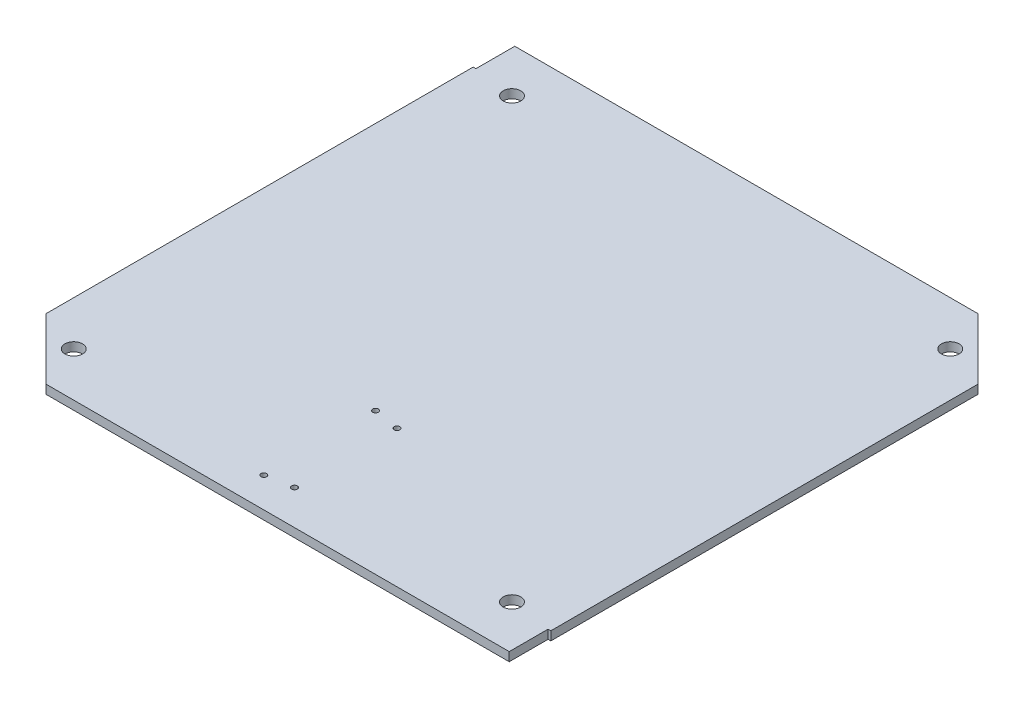
ISO-10303-21;
HEADER;
FILE_DESCRIPTION(('STEP AP214'),'2;1');
FILE_NAME('part.step','',(''),(''),'','','');
FILE_SCHEMA(('AUTOMOTIVE_DESIGN { 1 0 10303 214 1 1 1 1 }'));
ENDSEC;
DATA;
#1=APPLICATION_CONTEXT('core data for automotive mechanical design processes');
#2=APPLICATION_PROTOCOL_DEFINITION('international standard','automotive_design',2000,#1);
#3=PRODUCT_CONTEXT('',#1,'mechanical');
#4=PRODUCT('Part','Part','',(#3));
#5=PRODUCT_RELATED_PRODUCT_CATEGORY('part','',(#4));
#6=PRODUCT_DEFINITION_FORMATION('','',#4);
#7=PRODUCT_DEFINITION_CONTEXT('part definition',#1,'design');
#8=PRODUCT_DEFINITION('design','',#6,#7);
#9=PRODUCT_DEFINITION_SHAPE('','',#8);
#10=(LENGTH_UNIT() NAMED_UNIT(*) SI_UNIT(.MILLI.,.METRE.));
#11=(NAMED_UNIT(*) PLANE_ANGLE_UNIT() SI_UNIT($,.RADIAN.));
#12=(NAMED_UNIT(*) SI_UNIT($,.STERADIAN.) SOLID_ANGLE_UNIT());
#13=UNCERTAINTY_MEASURE_WITH_UNIT(LENGTH_MEASURE(1.E-05),#10,'distance_accuracy_value','');
#14=(GEOMETRIC_REPRESENTATION_CONTEXT(3) GLOBAL_UNCERTAINTY_ASSIGNED_CONTEXT((#13)) GLOBAL_UNIT_ASSIGNED_CONTEXT((#10,
#11,#12)) REPRESENTATION_CONTEXT('',''));
#15=CARTESIAN_POINT('',(0.,0.,0.));
#16=DIRECTION('',(0.,0.,1.));
#17=DIRECTION('',(1.,0.,0.));
#18=AXIS2_PLACEMENT_3D('',#15,#16,#17);
#19=CARTESIAN_POINT('',(-47.5,1.59,-40.5));
#20=DIRECTION('',(0.,0.,1.));
#21=DIRECTION('',(1.,0.,0.));
#22=AXIS2_PLACEMENT_3D('',#19,#20,#21);
#23=PLANE('',#22);
#24=DIRECTION('',(-1.,0.,0.));
#25=VECTOR('',#24,1.);
#26=CARTESIAN_POINT('',(-47.5,0.,-40.5));
#27=LINE('',#26,#25);
#28=CARTESIAN_POINT('',(-47.,0.,-40.5));
#29=VERTEX_POINT('',#28);
#30=CARTESIAN_POINT('',(-47.5,0.,-40.5));
#31=VERTEX_POINT('',#30);
#32=EDGE_CURVE('E153',#29,#31,#27,.T.);
#33=ORIENTED_EDGE('',*,*,#32,.T.);
#34=DIRECTION('',(0.,-1.,0.));
#35=VECTOR('',#34,1.);
#36=CARTESIAN_POINT('',(-47.5,1.59,-40.5));
#37=LINE('',#36,#35);
#38=CARTESIAN_POINT('',(-47.5,1.59,-40.5));
#39=VERTEX_POINT('',#38);
#40=EDGE_CURVE('E11',#39,#31,#37,.T.);
#41=ORIENTED_EDGE('',*,*,#40,.F.);
#42=DIRECTION('',(-1.,0.,0.));
#43=VECTOR('',#42,1.);
#44=CARTESIAN_POINT('',(-47.5,1.59,-40.5));
#45=LINE('',#44,#43);
#46=CARTESIAN_POINT('',(-47.,1.59,-40.5));
#47=VERTEX_POINT('',#46);
#48=EDGE_CURVE('E182',#47,#39,#45,.T.);
#49=ORIENTED_EDGE('',*,*,#48,.F.);
#50=DIRECTION('',(0.,-1.,0.));
#51=VECTOR('',#50,1.);
#52=CARTESIAN_POINT('',(-47.,1.59,-40.5));
#53=LINE('',#52,#51);
#54=EDGE_CURVE('E149',#47,#29,#53,.T.);
#55=ORIENTED_EDGE('',*,*,#54,.T.);
#56=EDGE_LOOP('',(#33,#41,#49,#55));
#57=FACE_BOUND('',#56,.T.);
#58=ADVANCED_FACE('F40',(#57),#23,.F.);
#59=CARTESIAN_POINT('',(-47.5,1.59,36.5));
#60=DIRECTION('',(1.,0.,0.));
#61=DIRECTION('',(0.,0.,-1.));
#62=AXIS2_PLACEMENT_3D('',#59,#60,#61);
#63=PLANE('',#62);
#64=DIRECTION('',(0.,0.,1.));
#65=VECTOR('',#64,1.);
#66=CARTESIAN_POINT('',(-47.5,0.,36.5));
#67=LINE('',#66,#65);
#68=CARTESIAN_POINT('',(-47.5,0.,36.5));
#69=VERTEX_POINT('',#68);
#70=EDGE_CURVE('E157',#31,#69,#67,.T.);
#71=ORIENTED_EDGE('',*,*,#70,.T.);
#72=DIRECTION('',(0.,-1.,0.));
#73=VECTOR('',#72,1.);
#74=CARTESIAN_POINT('',(-47.5,1.59,36.5));
#75=LINE('',#74,#73);
#76=CARTESIAN_POINT('',(-47.5,1.59,36.5));
#77=VERTEX_POINT('',#76);
#78=EDGE_CURVE('E49',#77,#69,#75,.T.);
#79=ORIENTED_EDGE('',*,*,#78,.F.);
#80=DIRECTION('',(0.,0.,1.));
#81=VECTOR('',#80,1.);
#82=CARTESIAN_POINT('',(-47.5,1.59,36.5));
#83=LINE('',#82,#81);
#84=EDGE_CURVE('E106',#39,#77,#83,.T.);
#85=ORIENTED_EDGE('',*,*,#84,.F.);
#86=ORIENTED_EDGE('',*,*,#40,.T.);
#87=EDGE_LOOP('',(#71,#79,#85,#86));
#88=FACE_BOUND('',#87,.T.);
#89=ADVANCED_FACE('F345',(#88),#63,.F.);
#90=CARTESIAN_POINT('',(-47.5,1.59,36.5));
#91=DIRECTION('',(0.707106781186548,0.,-0.707106781186547));
#92=DIRECTION('',(-0.707106781186547,0.,-0.707106781186548));
#93=AXIS2_PLACEMENT_3D('',#90,#91,#92);
#94=PLANE('',#93);
#95=DIRECTION('',(0.707106781186547,0.,0.707106781186548));
#96=VECTOR('',#95,1.);
#97=CARTESIAN_POINT('',(-47.5,0.,36.5));
#98=LINE('',#97,#96);
#99=CARTESIAN_POINT('',(-36.5,0.,47.5));
#100=VERTEX_POINT('',#99);
#101=EDGE_CURVE('E161',#69,#100,#98,.T.);
#102=ORIENTED_EDGE('',*,*,#101,.T.);
#103=DIRECTION('',(0.,-1.,0.));
#104=VECTOR('',#103,1.);
#105=CARTESIAN_POINT('',(-36.5,1.59,47.5));
#106=LINE('',#105,#104);
#107=CARTESIAN_POINT('',(-36.5,1.59,47.5));
#108=VERTEX_POINT('',#107);
#109=EDGE_CURVE('E201',#108,#100,#106,.T.);
#110=ORIENTED_EDGE('',*,*,#109,.F.);
#111=DIRECTION('',(0.707106781186547,0.,0.707106781186548));
#112=VECTOR('',#111,1.);
#113=CARTESIAN_POINT('',(-47.5,1.59,36.5));
#114=LINE('',#113,#112);
#115=EDGE_CURVE('E211',#77,#108,#114,.T.);
#116=ORIENTED_EDGE('',*,*,#115,.F.);
#117=ORIENTED_EDGE('',*,*,#78,.T.);
#118=EDGE_LOOP('',(#102,#110,#116,#117));
#119=FACE_BOUND('',#118,.T.);
#120=ADVANCED_FACE('F209',(#119),#94,.F.);
#121=CARTESIAN_POINT('',(-36.5,1.59,47.5));
#122=DIRECTION('',(0.,0.,-1.));
#123=DIRECTION('',(-1.,0.,0.));
#124=AXIS2_PLACEMENT_3D('',#121,#122,#123);
#125=PLANE('',#124);
#126=DIRECTION('',(1.,0.,0.));
#127=VECTOR('',#126,1.);
#128=CARTESIAN_POINT('',(-36.5,0.,47.5));
#129=LINE('',#128,#127);
#130=CARTESIAN_POINT('',(47.,0.,47.5));
#131=VERTEX_POINT('',#130);
#132=EDGE_CURVE('E164',#100,#131,#129,.T.);
#133=ORIENTED_EDGE('',*,*,#132,.T.);
#134=DIRECTION('',(0.,-1.,0.));
#135=VECTOR('',#134,1.);
#136=CARTESIAN_POINT('',(47.,1.59,47.5));
#137=LINE('',#136,#135);
#138=CARTESIAN_POINT('',(47.,1.59,47.5));
#139=VERTEX_POINT('',#138);
#140=EDGE_CURVE('E197',#139,#131,#137,.T.);
#141=ORIENTED_EDGE('',*,*,#140,.F.);
#142=DIRECTION('',(1.,0.,0.));
#143=VECTOR('',#142,1.);
#144=CARTESIAN_POINT('',(-36.5,1.59,47.5));
#145=LINE('',#144,#143);
#146=EDGE_CURVE('E230',#108,#139,#145,.T.);
#147=ORIENTED_EDGE('',*,*,#146,.F.);
#148=ORIENTED_EDGE('',*,*,#109,.T.);
#149=EDGE_LOOP('',(#133,#141,#147,#148));
#150=FACE_BOUND('',#149,.T.);
#151=ADVANCED_FACE('F220',(#150),#125,.F.);
#152=CARTESIAN_POINT('',(47.,1.59,47.5));
#153=DIRECTION('',(-1.,0.,0.));
#154=DIRECTION('',(0.,0.,1.));
#155=AXIS2_PLACEMENT_3D('',#152,#153,#154);
#156=PLANE('',#155);
#157=DIRECTION('',(0.,0.,-1.));
#158=VECTOR('',#157,1.);
#159=CARTESIAN_POINT('',(47.,0.,47.5));
#160=LINE('',#159,#158);
#161=CARTESIAN_POINT('',(47.,0.,40.5));
#162=VERTEX_POINT('',#161);
#163=EDGE_CURVE('E167',#131,#162,#160,.T.);
#164=ORIENTED_EDGE('',*,*,#163,.T.);
#165=DIRECTION('',(0.,-1.,0.));
#166=VECTOR('',#165,1.);
#167=CARTESIAN_POINT('',(47.,1.59,40.5));
#168=LINE('',#167,#166);
#169=CARTESIAN_POINT('',(47.,1.59,40.5));
#170=VERTEX_POINT('',#169);
#171=EDGE_CURVE('E193',#170,#162,#168,.T.);
#172=ORIENTED_EDGE('',*,*,#171,.F.);
#173=DIRECTION('',(0.,0.,-1.));
#174=VECTOR('',#173,1.);
#175=CARTESIAN_POINT('',(47.,1.59,47.5));
#176=LINE('',#175,#174);
#177=EDGE_CURVE('E226',#139,#170,#176,.T.);
#178=ORIENTED_EDGE('',*,*,#177,.F.);
#179=ORIENTED_EDGE('',*,*,#140,.T.);
#180=EDGE_LOOP('',(#164,#172,#178,#179));
#181=FACE_BOUND('',#180,.T.);
#182=ADVANCED_FACE('F224',(#181),#156,.F.);
#183=CARTESIAN_POINT('',(47.,1.59,40.5));
#184=DIRECTION('',(0.,0.,-1.));
#185=DIRECTION('',(-1.,0.,0.));
#186=AXIS2_PLACEMENT_3D('',#183,#184,#185);
#187=PLANE('',#186);
#188=DIRECTION('',(1.,0.,0.));
#189=VECTOR('',#188,1.);
#190=CARTESIAN_POINT('',(47.,0.,40.5));
#191=LINE('',#190,#189);
#192=CARTESIAN_POINT('',(47.5,0.,40.5));
#193=VERTEX_POINT('',#192);
#194=EDGE_CURVE('E170',#162,#193,#191,.T.);
#195=ORIENTED_EDGE('',*,*,#194,.T.);
#196=DIRECTION('',(0.,-1.,0.));
#197=VECTOR('',#196,1.);
#198=CARTESIAN_POINT('',(47.5,1.59,40.5));
#199=LINE('',#198,#197);
#200=CARTESIAN_POINT('',(47.5,1.59,40.5));
#201=VERTEX_POINT('',#200);
#202=EDGE_CURVE('E189',#201,#193,#199,.T.);
#203=ORIENTED_EDGE('',*,*,#202,.F.);
#204=DIRECTION('',(1.,0.,0.));
#205=VECTOR('',#204,1.);
#206=CARTESIAN_POINT('',(47.,1.59,40.5));
#207=LINE('',#206,#205);
#208=EDGE_CURVE('E229',#170,#201,#207,.T.);
#209=ORIENTED_EDGE('',*,*,#208,.F.);
#210=ORIENTED_EDGE('',*,*,#171,.T.);
#211=EDGE_LOOP('',(#195,#203,#209,#210));
#212=FACE_BOUND('',#211,.T.);
#213=ADVANCED_FACE('F357',(#212),#187,.F.);
#214=CARTESIAN_POINT('',(47.5,1.59,40.5));
#215=DIRECTION('',(-1.,0.,0.));
#216=DIRECTION('',(0.,0.,1.));
#217=AXIS2_PLACEMENT_3D('',#214,#215,#216);
#218=PLANE('',#217);
#219=DIRECTION('',(0.,0.,-1.));
#220=VECTOR('',#219,1.);
#221=CARTESIAN_POINT('',(47.5,0.,40.5));
#222=LINE('',#221,#220);
#223=CARTESIAN_POINT('',(47.5,0.,-36.5));
#224=VERTEX_POINT('',#223);
#225=EDGE_CURVE('E173',#193,#224,#222,.T.);
#226=ORIENTED_EDGE('',*,*,#225,.T.);
#227=DIRECTION('',(0.,-1.,0.));
#228=VECTOR('',#227,1.);
#229=CARTESIAN_POINT('',(47.5,1.59,-36.5));
#230=LINE('',#229,#228);
#231=CARTESIAN_POINT('',(47.5,1.59,-36.5));
#232=VERTEX_POINT('',#231);
#233=EDGE_CURVE('E142',#232,#224,#230,.T.);
#234=ORIENTED_EDGE('',*,*,#233,.F.);
#235=DIRECTION('',(0.,0.,-1.));
#236=VECTOR('',#235,1.);
#237=CARTESIAN_POINT('',(47.5,1.59,40.5));
#238=LINE('',#237,#236);
#239=EDGE_CURVE('E131',#201,#232,#238,.T.);
#240=ORIENTED_EDGE('',*,*,#239,.F.);
#241=ORIENTED_EDGE('',*,*,#202,.T.);
#242=EDGE_LOOP('',(#226,#234,#240,#241));
#243=FACE_BOUND('',#242,.T.);
#244=ADVANCED_FACE('F354',(#243),#218,.F.);
#245=CARTESIAN_POINT('',(36.5,1.59,-47.5));
#246=DIRECTION('',(-0.707106781186548,0.,0.707106781186547));
#247=DIRECTION('',(0.707106781186547,0.,0.707106781186548));
#248=AXIS2_PLACEMENT_3D('',#245,#246,#247);
#249=PLANE('',#248);
#250=DIRECTION('',(-0.707106781186547,0.,-0.707106781186548));
#251=VECTOR('',#250,1.);
#252=CARTESIAN_POINT('',(36.5,0.,-47.5));
#253=LINE('',#252,#251);
#254=CARTESIAN_POINT('',(36.5,0.,-47.5));
#255=VERTEX_POINT('',#254);
#256=EDGE_CURVE('E140',#224,#255,#253,.T.);
#257=ORIENTED_EDGE('',*,*,#256,.T.);
#258=DIRECTION('',(0.,-1.,0.));
#259=VECTOR('',#258,1.);
#260=CARTESIAN_POINT('',(36.5,1.59,-47.5));
#261=LINE('',#260,#259);
#262=CARTESIAN_POINT('',(36.5,1.59,-47.5));
#263=VERTEX_POINT('',#262);
#264=EDGE_CURVE('E137',#263,#255,#261,.T.);
#265=ORIENTED_EDGE('',*,*,#264,.F.);
#266=DIRECTION('',(-0.707106781186547,0.,-0.707106781186548));
#267=VECTOR('',#266,1.);
#268=CARTESIAN_POINT('',(36.5,1.59,-47.5));
#269=LINE('',#268,#267);
#270=EDGE_CURVE('E125',#232,#263,#269,.T.);
#271=ORIENTED_EDGE('',*,*,#270,.F.);
#272=ORIENTED_EDGE('',*,*,#233,.T.);
#273=EDGE_LOOP('',(#257,#265,#271,#272));
#274=FACE_BOUND('',#273,.T.);
#275=ADVANCED_FACE('F138',(#274),#249,.F.);
#276=CARTESIAN_POINT('',(-47.,1.59,-47.5));
#277=DIRECTION('',(0.,0.,1.));
#278=DIRECTION('',(1.,0.,0.));
#279=AXIS2_PLACEMENT_3D('',#276,#277,#278);
#280=PLANE('',#279);
#281=DIRECTION('',(-1.,0.,0.));
#282=VECTOR('',#281,1.);
#283=CARTESIAN_POINT('',(-47.,0.,-47.5));
#284=LINE('',#283,#282);
#285=CARTESIAN_POINT('',(-47.,0.,-47.5));
#286=VERTEX_POINT('',#285);
#287=EDGE_CURVE('E92',#255,#286,#284,.T.);
#288=ORIENTED_EDGE('',*,*,#287,.T.);
#289=DIRECTION('',(0.,-1.,0.));
#290=VECTOR('',#289,1.);
#291=CARTESIAN_POINT('',(-47.,1.59,-47.5));
#292=LINE('',#291,#290);
#293=CARTESIAN_POINT('',(-47.,1.59,-47.5));
#294=VERTEX_POINT('',#293);
#295=EDGE_CURVE('E143',#294,#286,#292,.T.);
#296=ORIENTED_EDGE('',*,*,#295,.F.);
#297=DIRECTION('',(-1.,0.,0.));
#298=VECTOR('',#297,1.);
#299=CARTESIAN_POINT('',(-47.,1.59,-47.5));
#300=LINE('',#299,#298);
#301=EDGE_CURVE('E129',#263,#294,#300,.T.);
#302=ORIENTED_EDGE('',*,*,#301,.F.);
#303=ORIENTED_EDGE('',*,*,#264,.T.);
#304=EDGE_LOOP('',(#288,#296,#302,#303));
#305=FACE_BOUND('',#304,.T.);
#306=ADVANCED_FACE('F145',(#305),#280,.F.);
#307=CARTESIAN_POINT('',(-47.,1.59,-40.5));
#308=DIRECTION('',(1.,0.,0.));
#309=DIRECTION('',(0.,0.,-1.));
#310=AXIS2_PLACEMENT_3D('',#307,#308,#309);
#311=PLANE('',#310);
#312=DIRECTION('',(0.,0.,1.));
#313=VECTOR('',#312,1.);
#314=CARTESIAN_POINT('',(-47.,0.,-40.5));
#315=LINE('',#314,#313);
#316=EDGE_CURVE('E98',#286,#29,#315,.T.);
#317=ORIENTED_EDGE('',*,*,#316,.T.);
#318=ORIENTED_EDGE('',*,*,#54,.F.);
#319=DIRECTION('',(0.,0.,1.));
#320=VECTOR('',#319,1.);
#321=CARTESIAN_POINT('',(-47.,1.59,-40.5));
#322=LINE('',#321,#320);
#323=EDGE_CURVE('E57',#294,#47,#322,.T.);
#324=ORIENTED_EDGE('',*,*,#323,.F.);
#325=ORIENTED_EDGE('',*,*,#295,.T.);
#326=EDGE_LOOP('',(#317,#318,#324,#325));
#327=FACE_BOUND('',#326,.T.);
#328=ADVANCED_FACE('F320',(#327),#311,.F.);
#329=CARTESIAN_POINT('',(0.,1.59,0.));
#330=DIRECTION('',(0.,1.,0.));
#331=DIRECTION('',(0.,0.,1.));
#332=AXIS2_PLACEMENT_3D('',#329,#330,#331);
#333=PLANE('',#332);
#334=CARTESIAN_POINT('',(-39.5,1.59,-39.5));
#335=DIRECTION('',(0.,1.,0.));
#336=DIRECTION('',(0.,0.,1.));
#337=AXIS2_PLACEMENT_3D('',#334,#335,#336);
#338=CIRCLE('',#337,1.59);
#339=CARTESIAN_POINT('',(-39.5,1.59,-37.91));
#340=VERTEX_POINT('',#339);
#341=EDGE_CURVE('E277',#340,#340,#338,.T.);
#342=ORIENTED_EDGE('',*,*,#341,.F.);
#343=EDGE_LOOP('',(#342));
#344=FACE_BOUND('',#343,.T.);
#345=CARTESIAN_POINT('',(39.5,1.59,-39.5));
#346=DIRECTION('',(0.,1.,0.));
#347=DIRECTION('',(0.,0.,1.));
#348=AXIS2_PLACEMENT_3D('',#345,#346,#347);
#349=CIRCLE('',#348,1.59);
#350=CARTESIAN_POINT('',(39.5,1.59,-37.91));
#351=VERTEX_POINT('',#350);
#352=EDGE_CURVE('E269',#351,#351,#349,.T.);
#353=ORIENTED_EDGE('',*,*,#352,.F.);
#354=EDGE_LOOP('',(#353));
#355=FACE_BOUND('',#354,.T.);
#356=CARTESIAN_POINT('',(39.5,1.59,39.5));
#357=DIRECTION('',(0.,1.,0.));
#358=DIRECTION('',(0.,0.,1.));
#359=AXIS2_PLACEMENT_3D('',#356,#357,#358);
#360=CIRCLE('',#359,1.59);
#361=CARTESIAN_POINT('',(39.5,1.59,41.09));
#362=VERTEX_POINT('',#361);
#363=EDGE_CURVE('E261',#362,#362,#360,.T.);
#364=ORIENTED_EDGE('',*,*,#363,.F.);
#365=EDGE_LOOP('',(#364));
#366=FACE_BOUND('',#365,.T.);
#367=CARTESIAN_POINT('',(-2.67000000000002,1.59,21.93));
#368=DIRECTION('',(0.,1.,0.));
#369=DIRECTION('',(0.,0.,1.));
#370=AXIS2_PLACEMENT_3D('',#367,#368,#369);
#371=CIRCLE('',#370,0.509999999999999);
#372=CARTESIAN_POINT('',(-2.67000000000002,1.59,22.44));
#373=VERTEX_POINT('',#372);
#374=EDGE_CURVE('E252',#373,#373,#371,.T.);
#375=ORIENTED_EDGE('',*,*,#374,.F.);
#376=EDGE_LOOP('',(#375));
#377=FACE_BOUND('',#376,.T.);
#378=CARTESIAN_POINT('',(2.02999999999999,1.59,41.24));
#379=DIRECTION('',(0.,1.,0.));
#380=DIRECTION('',(0.,0.,1.));
#381=AXIS2_PLACEMENT_3D('',#378,#379,#380);
#382=CIRCLE('',#381,0.510000000000002);
#383=CARTESIAN_POINT('',(2.02999999999999,1.59,41.75));
#384=VERTEX_POINT('',#383);
#385=EDGE_CURVE('E300',#384,#384,#382,.T.);
#386=ORIENTED_EDGE('',*,*,#385,.F.);
#387=EDGE_LOOP('',(#386));
#388=FACE_BOUND('',#387,.T.);
#389=CARTESIAN_POINT('',(-2.67000000000002,1.59,42.07));
#390=DIRECTION('',(0.,1.,0.));
#391=DIRECTION('',(0.,0.,1.));
#392=AXIS2_PLACEMENT_3D('',#389,#390,#391);
#393=CIRCLE('',#392,0.510000000000002);
#394=CARTESIAN_POINT('',(-2.67000000000002,1.59,42.58));
#395=VERTEX_POINT('',#394);
#396=EDGE_CURVE('E284',#395,#395,#393,.T.);
#397=ORIENTED_EDGE('',*,*,#396,.F.);
#398=EDGE_LOOP('',(#397));
#399=FACE_BOUND('',#398,.T.);
#400=CARTESIAN_POINT('',(2.02999999999999,1.59,22.75));
#401=DIRECTION('',(0.,1.,0.));
#402=DIRECTION('',(0.,0.,1.));
#403=AXIS2_PLACEMENT_3D('',#400,#401,#402);
#404=CIRCLE('',#403,0.509999999999999);
#405=CARTESIAN_POINT('',(2.02999999999999,1.59,23.26));
#406=VERTEX_POINT('',#405);
#407=EDGE_CURVE('E293',#406,#406,#404,.T.);
#408=ORIENTED_EDGE('',*,*,#407,.F.);
#409=EDGE_LOOP('',(#408));
#410=FACE_BOUND('',#409,.T.);
#411=CARTESIAN_POINT('',(-39.5,1.59,39.5));
#412=DIRECTION('',(0.,1.,0.));
#413=DIRECTION('',(0.,0.,1.));
#414=AXIS2_PLACEMENT_3D('',#411,#412,#413);
#415=CIRCLE('',#414,1.59);
#416=CARTESIAN_POINT('',(-39.5,1.59,41.09));
#417=VERTEX_POINT('',#416);
#418=EDGE_CURVE('E244',#417,#417,#415,.T.);
#419=ORIENTED_EDGE('',*,*,#418,.F.);
#420=EDGE_LOOP('',(#419));
#421=FACE_BOUND('',#420,.T.);
#422=ORIENTED_EDGE('',*,*,#48,.T.);
#423=ORIENTED_EDGE('',*,*,#84,.T.);
#424=ORIENTED_EDGE('',*,*,#115,.T.);
#425=ORIENTED_EDGE('',*,*,#146,.T.);
#426=ORIENTED_EDGE('',*,*,#177,.T.);
#427=ORIENTED_EDGE('',*,*,#208,.T.);
#428=ORIENTED_EDGE('',*,*,#239,.T.);
#429=ORIENTED_EDGE('',*,*,#270,.T.);
#430=ORIENTED_EDGE('',*,*,#301,.T.);
#431=ORIENTED_EDGE('',*,*,#323,.T.);
#432=EDGE_LOOP('',(#422,#423,#424,#425,#426,#427,#428,#429,#430,#431));
#433=FACE_BOUND('',#432,.T.);
#434=ADVANCED_FACE('F127',(#344,#355,#366,#377,#388,#399,#410,#421,#433),#333,.T.);
#435=CARTESIAN_POINT('',(0.,0.,0.));
#436=DIRECTION('',(0.,1.,0.));
#437=DIRECTION('',(0.,0.,1.));
#438=AXIS2_PLACEMENT_3D('',#435,#436,#437);
#439=PLANE('',#438);
#440=CARTESIAN_POINT('',(-39.5,0.,-39.5));
#441=DIRECTION('',(0.,1.,0.));
#442=DIRECTION('',(0.,0.,1.));
#443=AXIS2_PLACEMENT_3D('',#440,#441,#442);
#444=CIRCLE('',#443,1.59);
#445=CARTESIAN_POINT('',(-39.5,0.,-37.91));
#446=VERTEX_POINT('',#445);
#447=EDGE_CURVE('E248',#446,#446,#444,.T.);
#448=ORIENTED_EDGE('',*,*,#447,.T.);
#449=EDGE_LOOP('',(#448));
#450=FACE_BOUND('',#449,.T.);
#451=CARTESIAN_POINT('',(39.5,0.,-39.5));
#452=DIRECTION('',(0.,1.,0.));
#453=DIRECTION('',(0.,0.,1.));
#454=AXIS2_PLACEMENT_3D('',#451,#452,#453);
#455=CIRCLE('',#454,1.59);
#456=CARTESIAN_POINT('',(39.5,0.,-37.91));
#457=VERTEX_POINT('',#456);
#458=EDGE_CURVE('E273',#457,#457,#455,.T.);
#459=ORIENTED_EDGE('',*,*,#458,.T.);
#460=EDGE_LOOP('',(#459));
#461=FACE_BOUND('',#460,.T.);
#462=CARTESIAN_POINT('',(39.5,0.,39.5));
#463=DIRECTION('',(0.,1.,0.));
#464=DIRECTION('',(0.,0.,1.));
#465=AXIS2_PLACEMENT_3D('',#462,#463,#464);
#466=CIRCLE('',#465,1.59);
#467=CARTESIAN_POINT('',(39.5,0.,41.09));
#468=VERTEX_POINT('',#467);
#469=EDGE_CURVE('E265',#468,#468,#466,.T.);
#470=ORIENTED_EDGE('',*,*,#469,.T.);
#471=EDGE_LOOP('',(#470));
#472=FACE_BOUND('',#471,.T.);
#473=CARTESIAN_POINT('',(-2.67000000000002,0.,21.93));
#474=DIRECTION('',(0.,1.,0.));
#475=DIRECTION('',(0.,0.,1.));
#476=AXIS2_PLACEMENT_3D('',#473,#474,#475);
#477=CIRCLE('',#476,0.509999999999999);
#478=CARTESIAN_POINT('',(-2.67000000000002,0.,22.44));
#479=VERTEX_POINT('',#478);
#480=EDGE_CURVE('E256',#479,#479,#477,.T.);
#481=ORIENTED_EDGE('',*,*,#480,.T.);
#482=EDGE_LOOP('',(#481));
#483=FACE_BOUND('',#482,.T.);
#484=CARTESIAN_POINT('',(2.02999999999999,0.,41.24));
#485=DIRECTION('',(0.,1.,0.));
#486=DIRECTION('',(0.,0.,1.));
#487=AXIS2_PLACEMENT_3D('',#484,#485,#486);
#488=CIRCLE('',#487,0.510000000000002);
#489=CARTESIAN_POINT('',(2.02999999999999,0.,41.75));
#490=VERTEX_POINT('',#489);
#491=EDGE_CURVE('E289',#490,#490,#488,.T.);
#492=ORIENTED_EDGE('',*,*,#491,.T.);
#493=EDGE_LOOP('',(#492));
#494=FACE_BOUND('',#493,.T.);
#495=CARTESIAN_POINT('',(-2.67000000000002,0.,42.07));
#496=DIRECTION('',(0.,1.,0.));
#497=DIRECTION('',(0.,0.,1.));
#498=AXIS2_PLACEMENT_3D('',#495,#496,#497);
#499=CIRCLE('',#498,0.510000000000002);
#500=CARTESIAN_POINT('',(-2.67000000000002,0.,42.58));
#501=VERTEX_POINT('',#500);
#502=EDGE_CURVE('E288',#501,#501,#499,.T.);
#503=ORIENTED_EDGE('',*,*,#502,.T.);
#504=EDGE_LOOP('',(#503));
#505=FACE_BOUND('',#504,.T.);
#506=CARTESIAN_POINT('',(2.02999999999999,0.,22.75));
#507=DIRECTION('',(0.,1.,0.));
#508=DIRECTION('',(0.,0.,1.));
#509=AXIS2_PLACEMENT_3D('',#506,#507,#508);
#510=CIRCLE('',#509,0.509999999999999);
#511=CARTESIAN_POINT('',(2.02999999999999,0.,23.26));
#512=VERTEX_POINT('',#511);
#513=EDGE_CURVE('E257',#512,#512,#510,.T.);
#514=ORIENTED_EDGE('',*,*,#513,.T.);
#515=EDGE_LOOP('',(#514));
#516=FACE_BOUND('',#515,.T.);
#517=CARTESIAN_POINT('',(-39.5,0.,39.5));
#518=DIRECTION('',(0.,1.,0.));
#519=DIRECTION('',(0.,0.,1.));
#520=AXIS2_PLACEMENT_3D('',#517,#518,#519);
#521=CIRCLE('',#520,1.59);
#522=CARTESIAN_POINT('',(-39.5,0.,41.09));
#523=VERTEX_POINT('',#522);
#524=EDGE_CURVE('E158',#523,#523,#521,.T.);
#525=ORIENTED_EDGE('',*,*,#524,.T.);
#526=EDGE_LOOP('',(#525));
#527=FACE_BOUND('',#526,.T.);
#528=ORIENTED_EDGE('',*,*,#32,.F.);
#529=ORIENTED_EDGE('',*,*,#316,.F.);
#530=ORIENTED_EDGE('',*,*,#287,.F.);
#531=ORIENTED_EDGE('',*,*,#256,.F.);
#532=ORIENTED_EDGE('',*,*,#225,.F.);
#533=ORIENTED_EDGE('',*,*,#194,.F.);
#534=ORIENTED_EDGE('',*,*,#163,.F.);
#535=ORIENTED_EDGE('',*,*,#132,.F.);
#536=ORIENTED_EDGE('',*,*,#101,.F.);
#537=ORIENTED_EDGE('',*,*,#70,.F.);
#538=EDGE_LOOP('',(#528,#529,#530,#531,#532,#533,#534,#535,#536,#537));
#539=FACE_BOUND('',#538,.T.);
#540=ADVANCED_FACE('F215',(#450,#461,#472,#483,#494,#505,#516,#527,#539),#439,.F.);
#541=CARTESIAN_POINT('',(-39.5,0.,39.5));
#542=DIRECTION('',(0.,1.,0.));
#543=DIRECTION('',(0.,0.,1.));
#544=AXIS2_PLACEMENT_3D('',#541,#542,#543);
#545=CYLINDRICAL_SURFACE('',#544,1.59);
#546=CARTESIAN_POINT('',(-39.5,0.,41.09));
#547=CARTESIAN_POINT('',(-39.5,0.0165625,41.09));
#548=CARTESIAN_POINT('',(-39.5,0.033125,41.09));
#549=CARTESIAN_POINT('',(-39.5,0.06625,41.09));
#550=CARTESIAN_POINT('',(-39.5,0.0828125,41.09));
#551=CARTESIAN_POINT('',(-39.5,0.1159375,41.09));
#552=CARTESIAN_POINT('',(-39.5,0.1325,41.09));
#553=CARTESIAN_POINT('',(-39.5,0.165625,41.09));
#554=CARTESIAN_POINT('',(-39.5,0.1821875,41.09));
#555=CARTESIAN_POINT('',(-39.5,0.2153125,41.09));
#556=CARTESIAN_POINT('',(-39.5,0.231875,41.09));
#557=CARTESIAN_POINT('',(-39.5,0.265,41.09));
#558=CARTESIAN_POINT('',(-39.5,0.2815625,41.09));
#559=CARTESIAN_POINT('',(-39.5,0.3146875,41.09));
#560=CARTESIAN_POINT('',(-39.5,0.33125,41.09));
#561=CARTESIAN_POINT('',(-39.5,0.364375,41.09));
#562=CARTESIAN_POINT('',(-39.5,0.3809375,41.09));
#563=CARTESIAN_POINT('',(-39.5,0.4140625,41.09));
#564=CARTESIAN_POINT('',(-39.5,0.430625,41.09));
#565=CARTESIAN_POINT('',(-39.5,0.46375,41.09));
#566=CARTESIAN_POINT('',(-39.5,0.4803125,41.09));
#567=CARTESIAN_POINT('',(-39.5,0.5134375,41.09));
#568=CARTESIAN_POINT('',(-39.5,0.53,41.09));
#569=CARTESIAN_POINT('',(-39.5,0.563125,41.09));
#570=CARTESIAN_POINT('',(-39.5,0.5796875,41.09));
#571=CARTESIAN_POINT('',(-39.5,0.6128125,41.09));
#572=CARTESIAN_POINT('',(-39.5,0.629375,41.09));
#573=CARTESIAN_POINT('',(-39.5,0.6625,41.09));
#574=CARTESIAN_POINT('',(-39.5,0.6790625,41.09));
#575=CARTESIAN_POINT('',(-39.5,0.7121875,41.09));
#576=CARTESIAN_POINT('',(-39.5,0.72875,41.09));
#577=CARTESIAN_POINT('',(-39.5,0.761875,41.09));
#578=CARTESIAN_POINT('',(-39.5,0.7784375,41.09));
#579=CARTESIAN_POINT('',(-39.5,0.8115625,41.09));
#580=CARTESIAN_POINT('',(-39.5,0.828125,41.09));
#581=CARTESIAN_POINT('',(-39.5,0.86125,41.09));
#582=CARTESIAN_POINT('',(-39.5,0.8778125,41.09));
#583=CARTESIAN_POINT('',(-39.5,0.9109375,41.09));
#584=CARTESIAN_POINT('',(-39.5,0.9275,41.09));
#585=CARTESIAN_POINT('',(-39.5,0.960625,41.09));
#586=CARTESIAN_POINT('',(-39.5,0.9771875,41.09));
#587=CARTESIAN_POINT('',(-39.5,1.0103125,41.09));
#588=CARTESIAN_POINT('',(-39.5,1.026875,41.09));
#589=CARTESIAN_POINT('',(-39.5,1.06,41.09));
#590=CARTESIAN_POINT('',(-39.5,1.0765625,41.09));
#591=CARTESIAN_POINT('',(-39.5,1.1096875,41.09));
#592=CARTESIAN_POINT('',(-39.5,1.12625,41.09));
#593=CARTESIAN_POINT('',(-39.5,1.159375,41.09));
#594=CARTESIAN_POINT('',(-39.5,1.1759375,41.09));
#595=CARTESIAN_POINT('',(-39.5,1.2090625,41.09));
#596=CARTESIAN_POINT('',(-39.5,1.225625,41.09));
#597=CARTESIAN_POINT('',(-39.5,1.25875,41.09));
#598=CARTESIAN_POINT('',(-39.5,1.2753125,41.09));
#599=CARTESIAN_POINT('',(-39.5,1.3084375,41.09));
#600=CARTESIAN_POINT('',(-39.5,1.325,41.09));
#601=CARTESIAN_POINT('',(-39.5,1.358125,41.09));
#602=CARTESIAN_POINT('',(-39.5,1.3746875,41.09));
#603=CARTESIAN_POINT('',(-39.5,1.4078125,41.09));
#604=CARTESIAN_POINT('',(-39.5,1.424375,41.09));
#605=CARTESIAN_POINT('',(-39.5,1.4575,41.09));
#606=CARTESIAN_POINT('',(-39.5,1.4740625,41.09));
#607=CARTESIAN_POINT('',(-39.5,1.5071875,41.09));
#608=CARTESIAN_POINT('',(-39.5,1.52375,41.09));
#609=CARTESIAN_POINT('',(-39.5,1.556875,41.09));
#610=CARTESIAN_POINT('',(-39.5,1.5734375,41.09));
#611=CARTESIAN_POINT('',(-39.5,1.59,41.09));
#612=B_SPLINE_CURVE_WITH_KNOTS('',3,(#546,#547,#548,#549,#550,#551,#552,#553,#554,#555,#556,
#557,#558,#559,#560,#561,#562,#563,#564,#565,#566,#567,#568,#569,#570,#571,#572,#573,#574,#575,
#576,#577,#578,#579,#580,#581,#582,#583,#584,#585,#586,#587,#588,#589,#590,#591,#592,#593,#594,
#595,#596,#597,#598,#599,#600,#601,#602,#603,#604,#605,#606,#607,#608,#609,#610,#611),
.UNSPECIFIED.,.F.,.F.,(4,2,2,2,2,2,2,2,2,2,2,2,2,2,2,2,2,2,2,2,2,2,2,2,2,2,2,2,2,2,2,2,4),(0.,
0.0496875,0.099375,0.1490625,0.19875,0.2484375,0.298125,0.3478125,0.3975,0.4471875,0.496875,
0.5465625,0.59625,0.6459375,0.695625,0.7453125,0.795,0.8446875,0.894375,0.9440625,0.99375,
1.0434375,1.093125,1.1428125,1.1925,1.2421875,1.291875,1.3415625,1.39125,1.4409375,1.490625,
1.5403125,1.59),.UNSPECIFIED.);
#613=EDGE_CURVE('BSEAM329',#523,#417,#612,.T.);
#614=ORIENTED_EDGE('',*,*,#524,.F.);
#615=ORIENTED_EDGE('',*,*,#418,.T.);
#616=ORIENTED_EDGE('',*,*,#613,.T.);
#617=ORIENTED_EDGE('',*,*,#613,.F.);
#618=EDGE_LOOP('',(#614,#616,#615,#617));
#619=FACE_BOUND('',#618,.T.);
#620=ADVANCED_FACE('F329',(#619),#545,.F.);
#621=CARTESIAN_POINT('',(2.02999999999999,0.,22.75));
#622=DIRECTION('',(0.,1.,0.));
#623=DIRECTION('',(0.,0.,1.));
#624=AXIS2_PLACEMENT_3D('',#621,#622,#623);
#625=CYLINDRICAL_SURFACE('',#624,0.509999999999999);
#626=ORIENTED_EDGE('',*,*,#513,.F.);
#627=EDGE_LOOP('',(#626));
#628=FACE_BOUND('',#627,.T.);
#629=ORIENTED_EDGE('',*,*,#407,.T.);
#630=EDGE_LOOP('',(#629));
#631=FACE_BOUND('',#630,.T.);
#632=ADVANCED_FACE('F331',(#628,#631),#625,.F.);
#633=CARTESIAN_POINT('',(-2.67000000000002,0.,42.07));
#634=DIRECTION('',(0.,1.,0.));
#635=DIRECTION('',(0.,0.,1.));
#636=AXIS2_PLACEMENT_3D('',#633,#634,#635);
#637=CYLINDRICAL_SURFACE('',#636,0.510000000000002);
#638=ORIENTED_EDGE('',*,*,#502,.F.);
#639=EDGE_LOOP('',(#638));
#640=FACE_BOUND('',#639,.T.);
#641=ORIENTED_EDGE('',*,*,#396,.T.);
#642=EDGE_LOOP('',(#641));
#643=FACE_BOUND('',#642,.T.);
#644=ADVANCED_FACE('F314',(#640,#643),#637,.F.);
#645=CARTESIAN_POINT('',(2.02999999999999,0.,41.24));
#646=DIRECTION('',(0.,1.,0.));
#647=DIRECTION('',(0.,0.,1.));
#648=AXIS2_PLACEMENT_3D('',#645,#646,#647);
#649=CYLINDRICAL_SURFACE('',#648,0.510000000000002);
#650=ORIENTED_EDGE('',*,*,#491,.F.);
#651=EDGE_LOOP('',(#650));
#652=FACE_BOUND('',#651,.T.);
#653=ORIENTED_EDGE('',*,*,#385,.T.);
#654=EDGE_LOOP('',(#653));
#655=FACE_BOUND('',#654,.T.);
#656=ADVANCED_FACE('F310',(#652,#655),#649,.F.);
#657=CARTESIAN_POINT('',(-2.67000000000002,0.,21.93));
#658=DIRECTION('',(0.,1.,0.));
#659=DIRECTION('',(0.,0.,1.));
#660=AXIS2_PLACEMENT_3D('',#657,#658,#659);
#661=CYLINDRICAL_SURFACE('',#660,0.509999999999999);
#662=ORIENTED_EDGE('',*,*,#480,.F.);
#663=EDGE_LOOP('',(#662));
#664=FACE_BOUND('',#663,.T.);
#665=ORIENTED_EDGE('',*,*,#374,.T.);
#666=EDGE_LOOP('',(#665));
#667=FACE_BOUND('',#666,.T.);
#668=ADVANCED_FACE('F313',(#664,#667),#661,.F.);
#669=CARTESIAN_POINT('',(39.5,0.,39.5));
#670=DIRECTION('',(0.,1.,0.));
#671=DIRECTION('',(0.,0.,1.));
#672=AXIS2_PLACEMENT_3D('',#669,#670,#671);
#673=CYLINDRICAL_SURFACE('',#672,1.59);
#674=CARTESIAN_POINT('',(39.5,0.,41.09));
#675=CARTESIAN_POINT('',(39.5,0.0165625,41.09));
#676=CARTESIAN_POINT('',(39.5,0.033125,41.09));
#677=CARTESIAN_POINT('',(39.5,0.06625,41.09));
#678=CARTESIAN_POINT('',(39.5,0.0828125,41.09));
#679=CARTESIAN_POINT('',(39.5,0.1159375,41.09));
#680=CARTESIAN_POINT('',(39.5,0.1325,41.09));
#681=CARTESIAN_POINT('',(39.5,0.165625,41.09));
#682=CARTESIAN_POINT('',(39.5,0.1821875,41.09));
#683=CARTESIAN_POINT('',(39.5,0.2153125,41.09));
#684=CARTESIAN_POINT('',(39.5,0.231875,41.09));
#685=CARTESIAN_POINT('',(39.5,0.265,41.09));
#686=CARTESIAN_POINT('',(39.5,0.2815625,41.09));
#687=CARTESIAN_POINT('',(39.5,0.3146875,41.09));
#688=CARTESIAN_POINT('',(39.5,0.33125,41.09));
#689=CARTESIAN_POINT('',(39.5,0.364375,41.09));
#690=CARTESIAN_POINT('',(39.5,0.3809375,41.09));
#691=CARTESIAN_POINT('',(39.5,0.4140625,41.09));
#692=CARTESIAN_POINT('',(39.5,0.430625,41.09));
#693=CARTESIAN_POINT('',(39.5,0.46375,41.09));
#694=CARTESIAN_POINT('',(39.5,0.4803125,41.09));
#695=CARTESIAN_POINT('',(39.5,0.5134375,41.09));
#696=CARTESIAN_POINT('',(39.5,0.53,41.09));
#697=CARTESIAN_POINT('',(39.5,0.563125,41.09));
#698=CARTESIAN_POINT('',(39.5,0.5796875,41.09));
#699=CARTESIAN_POINT('',(39.5,0.6128125,41.09));
#700=CARTESIAN_POINT('',(39.5,0.629375,41.09));
#701=CARTESIAN_POINT('',(39.5,0.6625,41.09));
#702=CARTESIAN_POINT('',(39.5,0.6790625,41.09));
#703=CARTESIAN_POINT('',(39.5,0.7121875,41.09));
#704=CARTESIAN_POINT('',(39.5,0.72875,41.09));
#705=CARTESIAN_POINT('',(39.5,0.761875,41.09));
#706=CARTESIAN_POINT('',(39.5,0.7784375,41.09));
#707=CARTESIAN_POINT('',(39.5,0.8115625,41.09));
#708=CARTESIAN_POINT('',(39.5,0.828125,41.09));
#709=CARTESIAN_POINT('',(39.5,0.86125,41.09));
#710=CARTESIAN_POINT('',(39.5,0.8778125,41.09));
#711=CARTESIAN_POINT('',(39.5,0.9109375,41.09));
#712=CARTESIAN_POINT('',(39.5,0.9275,41.09));
#713=CARTESIAN_POINT('',(39.5,0.960625,41.09));
#714=CARTESIAN_POINT('',(39.5,0.9771875,41.09));
#715=CARTESIAN_POINT('',(39.5,1.0103125,41.09));
#716=CARTESIAN_POINT('',(39.5,1.026875,41.09));
#717=CARTESIAN_POINT('',(39.5,1.06,41.09));
#718=CARTESIAN_POINT('',(39.5,1.0765625,41.09));
#719=CARTESIAN_POINT('',(39.5,1.1096875,41.09));
#720=CARTESIAN_POINT('',(39.5,1.12625,41.09));
#721=CARTESIAN_POINT('',(39.5,1.159375,41.09));
#722=CARTESIAN_POINT('',(39.5,1.1759375,41.09));
#723=CARTESIAN_POINT('',(39.5,1.2090625,41.09));
#724=CARTESIAN_POINT('',(39.5,1.225625,41.09));
#725=CARTESIAN_POINT('',(39.5,1.25875,41.09));
#726=CARTESIAN_POINT('',(39.5,1.2753125,41.09));
#727=CARTESIAN_POINT('',(39.5,1.3084375,41.09));
#728=CARTESIAN_POINT('',(39.5,1.325,41.09));
#729=CARTESIAN_POINT('',(39.5,1.358125,41.09));
#730=CARTESIAN_POINT('',(39.5,1.3746875,41.09));
#731=CARTESIAN_POINT('',(39.5,1.4078125,41.09));
#732=CARTESIAN_POINT('',(39.5,1.424375,41.09));
#733=CARTESIAN_POINT('',(39.5,1.4575,41.09));
#734=CARTESIAN_POINT('',(39.5,1.4740625,41.09));
#735=CARTESIAN_POINT('',(39.5,1.5071875,41.09));
#736=CARTESIAN_POINT('',(39.5,1.52375,41.09));
#737=CARTESIAN_POINT('',(39.5,1.556875,41.09));
#738=CARTESIAN_POINT('',(39.5,1.5734375,41.09));
#739=CARTESIAN_POINT('',(39.5,1.59,41.09));
#740=B_SPLINE_CURVE_WITH_KNOTS('',3,(#674,#675,#676,#677,#678,#679,#680,#681,#682,#683,#684,
#685,#686,#687,#688,#689,#690,#691,#692,#693,#694,#695,#696,#697,#698,#699,#700,#701,#702,#703,
#704,#705,#706,#707,#708,#709,#710,#711,#712,#713,#714,#715,#716,#717,#718,#719,#720,#721,#722,
#723,#724,#725,#726,#727,#728,#729,#730,#731,#732,#733,#734,#735,#736,#737,#738,#739),
.UNSPECIFIED.,.F.,.F.,(4,2,2,2,2,2,2,2,2,2,2,2,2,2,2,2,2,2,2,2,2,2,2,2,2,2,2,2,2,2,2,2,4),(0.,
0.0496875,0.099375,0.1490625,0.19875,0.2484375,0.298125,0.3478125,0.3975,0.4471875,0.496875,
0.5465625,0.59625,0.6459375,0.695625,0.7453125,0.795,0.8446875,0.894375,0.9440625,0.99375,
1.0434375,1.093125,1.1428125,1.1925,1.2421875,1.291875,1.3415625,1.39125,1.4409375,1.490625,
1.5403125,1.59),.UNSPECIFIED.);
#741=EDGE_CURVE('BSEAM462',#468,#362,#740,.T.);
#742=ORIENTED_EDGE('',*,*,#469,.F.);
#743=ORIENTED_EDGE('',*,*,#363,.T.);
#744=ORIENTED_EDGE('',*,*,#741,.T.);
#745=ORIENTED_EDGE('',*,*,#741,.F.);
#746=EDGE_LOOP('',(#742,#744,#743,#745));
#747=FACE_BOUND('',#746,.T.);
#748=ADVANCED_FACE('F462',(#747),#673,.F.);
#749=CARTESIAN_POINT('',(39.5,0.,-39.5));
#750=DIRECTION('',(0.,1.,0.));
#751=DIRECTION('',(0.,0.,1.));
#752=AXIS2_PLACEMENT_3D('',#749,#750,#751);
#753=CYLINDRICAL_SURFACE('',#752,1.59);
#754=CARTESIAN_POINT('',(39.5,0.,-37.91));
#755=CARTESIAN_POINT('',(39.5,0.0165625,-37.91));
#756=CARTESIAN_POINT('',(39.5,0.033125,-37.91));
#757=CARTESIAN_POINT('',(39.5,0.06625,-37.91));
#758=CARTESIAN_POINT('',(39.5,0.0828125,-37.91));
#759=CARTESIAN_POINT('',(39.5,0.1159375,-37.91));
#760=CARTESIAN_POINT('',(39.5,0.1325,-37.91));
#761=CARTESIAN_POINT('',(39.5,0.165625,-37.91));
#762=CARTESIAN_POINT('',(39.5,0.1821875,-37.91));
#763=CARTESIAN_POINT('',(39.5,0.2153125,-37.91));
#764=CARTESIAN_POINT('',(39.5,0.231875,-37.91));
#765=CARTESIAN_POINT('',(39.5,0.265,-37.91));
#766=CARTESIAN_POINT('',(39.5,0.2815625,-37.91));
#767=CARTESIAN_POINT('',(39.5,0.3146875,-37.91));
#768=CARTESIAN_POINT('',(39.5,0.33125,-37.91));
#769=CARTESIAN_POINT('',(39.5,0.364375,-37.91));
#770=CARTESIAN_POINT('',(39.5,0.3809375,-37.91));
#771=CARTESIAN_POINT('',(39.5,0.4140625,-37.91));
#772=CARTESIAN_POINT('',(39.5,0.430625,-37.91));
#773=CARTESIAN_POINT('',(39.5,0.46375,-37.91));
#774=CARTESIAN_POINT('',(39.5,0.4803125,-37.91));
#775=CARTESIAN_POINT('',(39.5,0.5134375,-37.91));
#776=CARTESIAN_POINT('',(39.5,0.53,-37.91));
#777=CARTESIAN_POINT('',(39.5,0.563125,-37.91));
#778=CARTESIAN_POINT('',(39.5,0.5796875,-37.91));
#779=CARTESIAN_POINT('',(39.5,0.6128125,-37.91));
#780=CARTESIAN_POINT('',(39.5,0.629375,-37.91));
#781=CARTESIAN_POINT('',(39.5,0.6625,-37.91));
#782=CARTESIAN_POINT('',(39.5,0.6790625,-37.91));
#783=CARTESIAN_POINT('',(39.5,0.7121875,-37.91));
#784=CARTESIAN_POINT('',(39.5,0.72875,-37.91));
#785=CARTESIAN_POINT('',(39.5,0.761875,-37.91));
#786=CARTESIAN_POINT('',(39.5,0.7784375,-37.91));
#787=CARTESIAN_POINT('',(39.5,0.8115625,-37.91));
#788=CARTESIAN_POINT('',(39.5,0.828125,-37.91));
#789=CARTESIAN_POINT('',(39.5,0.86125,-37.91));
#790=CARTESIAN_POINT('',(39.5,0.8778125,-37.91));
#791=CARTESIAN_POINT('',(39.5,0.9109375,-37.91));
#792=CARTESIAN_POINT('',(39.5,0.9275,-37.91));
#793=CARTESIAN_POINT('',(39.5,0.960625,-37.91));
#794=CARTESIAN_POINT('',(39.5,0.9771875,-37.91));
#795=CARTESIAN_POINT('',(39.5,1.0103125,-37.91));
#796=CARTESIAN_POINT('',(39.5,1.026875,-37.91));
#797=CARTESIAN_POINT('',(39.5,1.06,-37.91));
#798=CARTESIAN_POINT('',(39.5,1.0765625,-37.91));
#799=CARTESIAN_POINT('',(39.5,1.1096875,-37.91));
#800=CARTESIAN_POINT('',(39.5,1.12625,-37.91));
#801=CARTESIAN_POINT('',(39.5,1.159375,-37.91));
#802=CARTESIAN_POINT('',(39.5,1.1759375,-37.91));
#803=CARTESIAN_POINT('',(39.5,1.2090625,-37.91));
#804=CARTESIAN_POINT('',(39.5,1.225625,-37.91));
#805=CARTESIAN_POINT('',(39.5,1.25875,-37.91));
#806=CARTESIAN_POINT('',(39.5,1.2753125,-37.91));
#807=CARTESIAN_POINT('',(39.5,1.3084375,-37.91));
#808=CARTESIAN_POINT('',(39.5,1.325,-37.91));
#809=CARTESIAN_POINT('',(39.5,1.358125,-37.91));
#810=CARTESIAN_POINT('',(39.5,1.3746875,-37.91));
#811=CARTESIAN_POINT('',(39.5,1.4078125,-37.91));
#812=CARTESIAN_POINT('',(39.5,1.424375,-37.91));
#813=CARTESIAN_POINT('',(39.5,1.4575,-37.91));
#814=CARTESIAN_POINT('',(39.5,1.4740625,-37.91));
#815=CARTESIAN_POINT('',(39.5,1.5071875,-37.91));
#816=CARTESIAN_POINT('',(39.5,1.52375,-37.91));
#817=CARTESIAN_POINT('',(39.5,1.556875,-37.91));
#818=CARTESIAN_POINT('',(39.5,1.5734375,-37.91));
#819=CARTESIAN_POINT('',(39.5,1.59,-37.91));
#820=B_SPLINE_CURVE_WITH_KNOTS('',3,(#754,#755,#756,#757,#758,#759,#760,#761,#762,#763,#764,
#765,#766,#767,#768,#769,#770,#771,#772,#773,#774,#775,#776,#777,#778,#779,#780,#781,#782,#783,
#784,#785,#786,#787,#788,#789,#790,#791,#792,#793,#794,#795,#796,#797,#798,#799,#800,#801,#802,
#803,#804,#805,#806,#807,#808,#809,#810,#811,#812,#813,#814,#815,#816,#817,#818,#819),
.UNSPECIFIED.,.F.,.F.,(4,2,2,2,2,2,2,2,2,2,2,2,2,2,2,2,2,2,2,2,2,2,2,2,2,2,2,2,2,2,2,2,4),(0.,
0.0496875,0.099375,0.1490625,0.19875,0.2484375,0.298125,0.3478125,0.3975,0.4471875,0.496875,
0.5465625,0.59625,0.6459375,0.695625,0.7453125,0.795,0.8446875,0.894375,0.9440625,0.99375,
1.0434375,1.093125,1.1428125,1.1925,1.2421875,1.291875,1.3415625,1.39125,1.4409375,1.490625,
1.5403125,1.59),.UNSPECIFIED.);
#821=EDGE_CURVE('BSEAM471',#457,#351,#820,.T.);
#822=ORIENTED_EDGE('',*,*,#458,.F.);
#823=ORIENTED_EDGE('',*,*,#352,.T.);
#824=ORIENTED_EDGE('',*,*,#821,.T.);
#825=ORIENTED_EDGE('',*,*,#821,.F.);
#826=EDGE_LOOP('',(#822,#824,#823,#825));
#827=FACE_BOUND('',#826,.T.);
#828=ADVANCED_FACE('F471',(#827),#753,.F.);
#829=CARTESIAN_POINT('',(-39.5,0.,-39.5));
#830=DIRECTION('',(0.,1.,0.));
#831=DIRECTION('',(0.,0.,1.));
#832=AXIS2_PLACEMENT_3D('',#829,#830,#831);
#833=CYLINDRICAL_SURFACE('',#832,1.59);
#834=CARTESIAN_POINT('',(-39.5,0.,-37.91));
#835=CARTESIAN_POINT('',(-39.5,0.0165625,-37.91));
#836=CARTESIAN_POINT('',(-39.5,0.033125,-37.91));
#837=CARTESIAN_POINT('',(-39.5,0.06625,-37.91));
#838=CARTESIAN_POINT('',(-39.5,0.0828125,-37.91));
#839=CARTESIAN_POINT('',(-39.5,0.1159375,-37.91));
#840=CARTESIAN_POINT('',(-39.5,0.1325,-37.91));
#841=CARTESIAN_POINT('',(-39.5,0.165625,-37.91));
#842=CARTESIAN_POINT('',(-39.5,0.1821875,-37.91));
#843=CARTESIAN_POINT('',(-39.5,0.2153125,-37.91));
#844=CARTESIAN_POINT('',(-39.5,0.231875,-37.91));
#845=CARTESIAN_POINT('',(-39.5,0.265,-37.91));
#846=CARTESIAN_POINT('',(-39.5,0.2815625,-37.91));
#847=CARTESIAN_POINT('',(-39.5,0.3146875,-37.91));
#848=CARTESIAN_POINT('',(-39.5,0.33125,-37.91));
#849=CARTESIAN_POINT('',(-39.5,0.364375,-37.91));
#850=CARTESIAN_POINT('',(-39.5,0.3809375,-37.91));
#851=CARTESIAN_POINT('',(-39.5,0.4140625,-37.91));
#852=CARTESIAN_POINT('',(-39.5,0.430625,-37.91));
#853=CARTESIAN_POINT('',(-39.5,0.46375,-37.91));
#854=CARTESIAN_POINT('',(-39.5,0.4803125,-37.91));
#855=CARTESIAN_POINT('',(-39.5,0.5134375,-37.91));
#856=CARTESIAN_POINT('',(-39.5,0.53,-37.91));
#857=CARTESIAN_POINT('',(-39.5,0.563125,-37.91));
#858=CARTESIAN_POINT('',(-39.5,0.5796875,-37.91));
#859=CARTESIAN_POINT('',(-39.5,0.6128125,-37.91));
#860=CARTESIAN_POINT('',(-39.5,0.629375,-37.91));
#861=CARTESIAN_POINT('',(-39.5,0.6625,-37.91));
#862=CARTESIAN_POINT('',(-39.5,0.6790625,-37.91));
#863=CARTESIAN_POINT('',(-39.5,0.7121875,-37.91));
#864=CARTESIAN_POINT('',(-39.5,0.72875,-37.91));
#865=CARTESIAN_POINT('',(-39.5,0.761875,-37.91));
#866=CARTESIAN_POINT('',(-39.5,0.7784375,-37.91));
#867=CARTESIAN_POINT('',(-39.5,0.8115625,-37.91));
#868=CARTESIAN_POINT('',(-39.5,0.828125,-37.91));
#869=CARTESIAN_POINT('',(-39.5,0.86125,-37.91));
#870=CARTESIAN_POINT('',(-39.5,0.8778125,-37.91));
#871=CARTESIAN_POINT('',(-39.5,0.9109375,-37.91));
#872=CARTESIAN_POINT('',(-39.5,0.9275,-37.91));
#873=CARTESIAN_POINT('',(-39.5,0.960625,-37.91));
#874=CARTESIAN_POINT('',(-39.5,0.9771875,-37.91));
#875=CARTESIAN_POINT('',(-39.5,1.0103125,-37.91));
#876=CARTESIAN_POINT('',(-39.5,1.026875,-37.91));
#877=CARTESIAN_POINT('',(-39.5,1.06,-37.91));
#878=CARTESIAN_POINT('',(-39.5,1.0765625,-37.91));
#879=CARTESIAN_POINT('',(-39.5,1.1096875,-37.91));
#880=CARTESIAN_POINT('',(-39.5,1.12625,-37.91));
#881=CARTESIAN_POINT('',(-39.5,1.159375,-37.91));
#882=CARTESIAN_POINT('',(-39.5,1.1759375,-37.91));
#883=CARTESIAN_POINT('',(-39.5,1.2090625,-37.91));
#884=CARTESIAN_POINT('',(-39.5,1.225625,-37.91));
#885=CARTESIAN_POINT('',(-39.5,1.25875,-37.91));
#886=CARTESIAN_POINT('',(-39.5,1.2753125,-37.91));
#887=CARTESIAN_POINT('',(-39.5,1.3084375,-37.91));
#888=CARTESIAN_POINT('',(-39.5,1.325,-37.91));
#889=CARTESIAN_POINT('',(-39.5,1.358125,-37.91));
#890=CARTESIAN_POINT('',(-39.5,1.3746875,-37.91));
#891=CARTESIAN_POINT('',(-39.5,1.4078125,-37.91));
#892=CARTESIAN_POINT('',(-39.5,1.424375,-37.91));
#893=CARTESIAN_POINT('',(-39.5,1.4575,-37.91));
#894=CARTESIAN_POINT('',(-39.5,1.4740625,-37.91));
#895=CARTESIAN_POINT('',(-39.5,1.5071875,-37.91));
#896=CARTESIAN_POINT('',(-39.5,1.52375,-37.91));
#897=CARTESIAN_POINT('',(-39.5,1.556875,-37.91));
#898=CARTESIAN_POINT('',(-39.5,1.5734375,-37.91));
#899=CARTESIAN_POINT('',(-39.5,1.59,-37.91));
#900=B_SPLINE_CURVE_WITH_KNOTS('',3,(#834,#835,#836,#837,#838,#839,#840,#841,#842,#843,#844,
#845,#846,#847,#848,#849,#850,#851,#852,#853,#854,#855,#856,#857,#858,#859,#860,#861,#862,#863,
#864,#865,#866,#867,#868,#869,#870,#871,#872,#873,#874,#875,#876,#877,#878,#879,#880,#881,#882,
#883,#884,#885,#886,#887,#888,#889,#890,#891,#892,#893,#894,#895,#896,#897,#898,#899),
.UNSPECIFIED.,.F.,.F.,(4,2,2,2,2,2,2,2,2,2,2,2,2,2,2,2,2,2,2,2,2,2,2,2,2,2,2,2,2,2,2,2,4),(0.,
0.0496875,0.099375,0.1490625,0.19875,0.2484375,0.298125,0.3478125,0.3975,0.4471875,0.496875,
0.5465625,0.59625,0.6459375,0.695625,0.7453125,0.795,0.8446875,0.894375,0.9440625,0.99375,
1.0434375,1.093125,1.1428125,1.1925,1.2421875,1.291875,1.3415625,1.39125,1.4409375,1.490625,
1.5403125,1.59),.UNSPECIFIED.);
#901=EDGE_CURVE('BSEAM481',#446,#340,#900,.T.);
#902=ORIENTED_EDGE('',*,*,#447,.F.);
#903=ORIENTED_EDGE('',*,*,#341,.T.);
#904=ORIENTED_EDGE('',*,*,#901,.T.);
#905=ORIENTED_EDGE('',*,*,#901,.F.);
#906=EDGE_LOOP('',(#902,#904,#903,#905));
#907=FACE_BOUND('',#906,.T.);
#908=ADVANCED_FACE('F481',(#907),#833,.F.);
#909=CLOSED_SHELL('',(#58,#89,#120,#151,#182,#213,#244,#275,#306,#328,#434,#540,#620,#632,#644,
#656,#668,#748,#828,#908));
#910=MANIFOLD_SOLID_BREP('B2',#909);
#911=ADVANCED_BREP_SHAPE_REPRESENTATION('',(#18,#910),#14);
#912=SHAPE_DEFINITION_REPRESENTATION(#9,#911);
ENDSEC;
END-ISO-10303-21;
